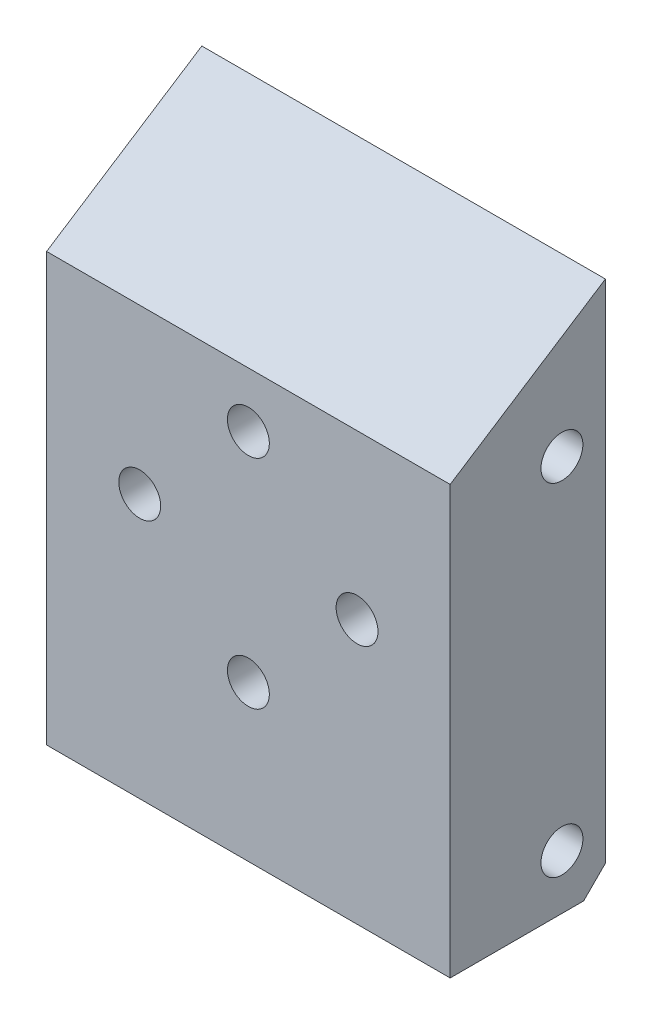
ISO-10303-21;
HEADER;
FILE_DESCRIPTION(('STEP AP214'),'2;1');
FILE_NAME('part.step','',(''),(''),'','','');
FILE_SCHEMA(('AUTOMOTIVE_DESIGN { 1 0 10303 214 1 1 1 1 }'));
ENDSEC;
DATA;
#1=APPLICATION_CONTEXT('core data for automotive mechanical design processes');
#2=APPLICATION_PROTOCOL_DEFINITION('international standard','automotive_design',2000,#1);
#3=PRODUCT_CONTEXT('',#1,'mechanical');
#4=PRODUCT('Part','Part','',(#3));
#5=PRODUCT_RELATED_PRODUCT_CATEGORY('part','',(#4));
#6=PRODUCT_DEFINITION_FORMATION('','',#4);
#7=PRODUCT_DEFINITION_CONTEXT('part definition',#1,'design');
#8=PRODUCT_DEFINITION('design','',#6,#7);
#9=PRODUCT_DEFINITION_SHAPE('','',#8);
#10=(LENGTH_UNIT() NAMED_UNIT(*) SI_UNIT(.MILLI.,.METRE.));
#11=(NAMED_UNIT(*) PLANE_ANGLE_UNIT() SI_UNIT($,.RADIAN.));
#12=(NAMED_UNIT(*) SI_UNIT($,.STERADIAN.) SOLID_ANGLE_UNIT());
#13=UNCERTAINTY_MEASURE_WITH_UNIT(LENGTH_MEASURE(1.E-05),#10,'distance_accuracy_value','');
#14=(GEOMETRIC_REPRESENTATION_CONTEXT(3) GLOBAL_UNCERTAINTY_ASSIGNED_CONTEXT((#13)) GLOBAL_UNIT_ASSIGNED_CONTEXT((#10,
#11,#12)) REPRESENTATION_CONTEXT('',''));
#15=CARTESIAN_POINT('',(0.,0.,0.));
#16=DIRECTION('',(0.,0.,1.));
#17=DIRECTION('',(1.,0.,0.));
#18=AXIS2_PLACEMENT_3D('',#15,#16,#17);
#19=CARTESIAN_POINT('',(13.,-17.,10.));
#20=DIRECTION('',(-1.,0.,0.));
#21=DIRECTION('',(0.,0.,1.));
#22=AXIS2_PLACEMENT_3D('',#19,#20,#21);
#23=PLANE('',#22);
#24=CARTESIAN_POINT('',(13.,8.50000000000001,2.8));
#25=DIRECTION('',(1.,0.,0.));
#26=DIRECTION('',(0.,0.,-1.));
#27=AXIS2_PLACEMENT_3D('',#24,#25,#26);
#28=CIRCLE('',#27,1.35);
#29=CARTESIAN_POINT('',(13.,8.50000000000001,1.45));
#30=VERTEX_POINT('',#29);
#31=EDGE_CURVE('E382',#30,#30,#28,.T.);
#32=ORIENTED_EDGE('',*,*,#31,.F.);
#33=EDGE_LOOP('',(#32));
#34=FACE_BOUND('',#33,.T.);
#35=CARTESIAN_POINT('',(13.,-13.5,2.8));
#36=DIRECTION('',(1.,0.,0.));
#37=DIRECTION('',(0.,0.,-1.));
#38=AXIS2_PLACEMENT_3D('',#35,#36,#37);
#39=CIRCLE('',#38,1.35);
#40=CARTESIAN_POINT('',(13.,-13.5,1.45));
#41=VERTEX_POINT('',#40);
#42=EDGE_CURVE('E376',#41,#41,#39,.T.);
#43=ORIENTED_EDGE('',*,*,#42,.F.);
#44=EDGE_LOOP('',(#43));
#45=FACE_BOUND('',#44,.T.);
#46=DIRECTION('',(0.,1.,0.));
#47=VECTOR('',#46,1.);
#48=CARTESIAN_POINT('',(13.,-17.,0.));
#49=LINE('',#48,#47);
#50=CARTESIAN_POINT('',(13.,-15.6,0.));
#51=VERTEX_POINT('',#50);
#52=CARTESIAN_POINT('',(13.,17.,0.));
#53=VERTEX_POINT('',#52);
#54=EDGE_CURVE('E99',#51,#53,#49,.T.);
#55=ORIENTED_EDGE('',*,*,#54,.T.);
#56=DIRECTION('',(0.,0.542738573048496,-0.839901685511633));
#57=VECTOR('',#56,1.);
#58=CARTESIAN_POINT('',(13.,10.5380702002297,10.));
#59=LINE('',#58,#57);
#60=CARTESIAN_POINT('',(13.,10.5380702002297,10.));
#61=VERTEX_POINT('',#60);
#62=EDGE_CURVE('E92',#61,#53,#59,.T.);
#63=ORIENTED_EDGE('',*,*,#62,.F.);
#64=DIRECTION('',(0.,1.,0.));
#65=VECTOR('',#64,1.);
#66=CARTESIAN_POINT('',(13.,-17.,10.));
#67=LINE('',#66,#65);
#68=CARTESIAN_POINT('',(13.,-17.,10.));
#69=VERTEX_POINT('',#68);
#70=EDGE_CURVE('E102',#69,#61,#67,.T.);
#71=ORIENTED_EDGE('',*,*,#70,.F.);
#72=DIRECTION('',(0.,0.,-1.));
#73=VECTOR('',#72,1.);
#74=CARTESIAN_POINT('',(13.,-17.,10.));
#75=LINE('',#74,#73);
#76=CARTESIAN_POINT('',(13.,-17.,1.4));
#77=VERTEX_POINT('',#76);
#78=EDGE_CURVE('E124',#69,#77,#75,.T.);
#79=ORIENTED_EDGE('',*,*,#78,.T.);
#80=DIRECTION('',(0.,0.707106781186549,-0.707106781186546));
#81=VECTOR('',#80,1.);
#82=CARTESIAN_POINT('',(13.,-17.,1.4));
#83=LINE('',#82,#81);
#84=EDGE_CURVE('E65',#77,#51,#83,.T.);
#85=ORIENTED_EDGE('',*,*,#84,.T.);
#86=EDGE_LOOP('',(#55,#63,#71,#79,#85));
#87=FACE_BOUND('',#86,.T.);
#88=ADVANCED_FACE('F41',(#34,#45,#87),#23,.F.);
#89=CARTESIAN_POINT('',(-13.,-17.,10.));
#90=DIRECTION('',(1.,0.,0.));
#91=DIRECTION('',(0.,0.,-1.));
#92=AXIS2_PLACEMENT_3D('',#89,#90,#91);
#93=PLANE('',#92);
#94=CARTESIAN_POINT('',(-13.,8.50000000000001,2.8));
#95=DIRECTION('',(-1.,0.,0.));
#96=DIRECTION('',(0.,0.,1.));
#97=AXIS2_PLACEMENT_3D('',#94,#95,#96);
#98=CIRCLE('',#97,1.025);
#99=CARTESIAN_POINT('',(-13.,8.50000000000001,3.825));
#100=VERTEX_POINT('',#99);
#101=EDGE_CURVE('E385',#100,#100,#98,.T.);
#102=ORIENTED_EDGE('',*,*,#101,.F.);
#103=EDGE_LOOP('',(#102));
#104=FACE_BOUND('',#103,.T.);
#105=CARTESIAN_POINT('',(-13.,-13.5,2.8));
#106=DIRECTION('',(-1.,0.,0.));
#107=DIRECTION('',(0.,0.,1.));
#108=AXIS2_PLACEMENT_3D('',#105,#106,#107);
#109=CIRCLE('',#108,1.025);
#110=CARTESIAN_POINT('',(-13.,-13.5,3.825));
#111=VERTEX_POINT('',#110);
#112=EDGE_CURVE('E396',#111,#111,#109,.T.);
#113=ORIENTED_EDGE('',*,*,#112,.F.);
#114=EDGE_LOOP('',(#113));
#115=FACE_BOUND('',#114,.T.);
#116=DIRECTION('',(0.,-1.,0.));
#117=VECTOR('',#116,1.);
#118=CARTESIAN_POINT('',(-13.,-17.,10.));
#119=LINE('',#118,#117);
#120=CARTESIAN_POINT('',(-13.,10.5380702002297,10.));
#121=VERTEX_POINT('',#120);
#122=CARTESIAN_POINT('',(-13.,-17.,10.));
#123=VERTEX_POINT('',#122);
#124=EDGE_CURVE('E112',#121,#123,#119,.T.);
#125=ORIENTED_EDGE('',*,*,#124,.F.);
#126=DIRECTION('',(0.,0.542738573048496,-0.839901685511633));
#127=VECTOR('',#126,1.);
#128=CARTESIAN_POINT('',(-13.,10.5380702002297,10.));
#129=LINE('',#128,#127);
#130=CARTESIAN_POINT('',(-13.,17.,0.));
#131=VERTEX_POINT('',#130);
#132=EDGE_CURVE('E94',#121,#131,#129,.T.);
#133=ORIENTED_EDGE('',*,*,#132,.T.);
#134=DIRECTION('',(0.,-1.,0.));
#135=VECTOR('',#134,1.);
#136=CARTESIAN_POINT('',(-13.,-17.,0.));
#137=LINE('',#136,#135);
#138=CARTESIAN_POINT('',(-13.,-15.6,0.));
#139=VERTEX_POINT('',#138);
#140=EDGE_CURVE('E113',#131,#139,#137,.T.);
#141=ORIENTED_EDGE('',*,*,#140,.T.);
#142=DIRECTION('',(0.,-0.707106781186549,0.707106781186546));
#143=VECTOR('',#142,1.);
#144=CARTESIAN_POINT('',(-13.,-17.,1.4));
#145=LINE('',#144,#143);
#146=CARTESIAN_POINT('',(-13.,-17.,1.4));
#147=VERTEX_POINT('',#146);
#148=EDGE_CURVE('E11',#139,#147,#145,.T.);
#149=ORIENTED_EDGE('',*,*,#148,.T.);
#150=DIRECTION('',(0.,0.,-1.));
#151=VECTOR('',#150,1.);
#152=CARTESIAN_POINT('',(-13.,-17.,10.));
#153=LINE('',#152,#151);
#154=EDGE_CURVE('E131',#123,#147,#153,.T.);
#155=ORIENTED_EDGE('',*,*,#154,.F.);
#156=EDGE_LOOP('',(#125,#133,#141,#149,#155));
#157=FACE_BOUND('',#156,.T.);
#158=ADVANCED_FACE('F148',(#104,#115,#157),#93,.F.);
#159=CARTESIAN_POINT('',(-13.,-17.,10.));
#160=DIRECTION('',(0.,1.,0.));
#161=DIRECTION('',(0.,0.,1.));
#162=AXIS2_PLACEMENT_3D('',#159,#160,#161);
#163=PLANE('',#162);
#164=ORIENTED_EDGE('',*,*,#154,.T.);
#165=DIRECTION('',(1.,0.,0.));
#166=VECTOR('',#165,1.);
#167=CARTESIAN_POINT('',(13.,-17.,1.4));
#168=LINE('',#167,#166);
#169=EDGE_CURVE('E135',#147,#77,#168,.T.);
#170=ORIENTED_EDGE('',*,*,#169,.T.);
#171=ORIENTED_EDGE('',*,*,#78,.F.);
#172=DIRECTION('',(1.,0.,0.));
#173=VECTOR('',#172,1.);
#174=CARTESIAN_POINT('',(-13.,-17.,10.));
#175=LINE('',#174,#173);
#176=EDGE_CURVE('E109',#123,#69,#175,.T.);
#177=ORIENTED_EDGE('',*,*,#176,.F.);
#178=EDGE_LOOP('',(#164,#170,#171,#177));
#179=FACE_BOUND('',#178,.T.);
#180=ADVANCED_FACE('F143',(#179),#163,.F.);
#181=CARTESIAN_POINT('',(0.,0.,10.));
#182=DIRECTION('',(0.,0.,-1.));
#183=DIRECTION('',(-1.,0.,0.));
#184=AXIS2_PLACEMENT_3D('',#181,#182,#183);
#185=PLANE('',#184);
#186=CARTESIAN_POINT('',(7.,0.,10.));
#187=DIRECTION('',(0.,0.,1.));
#188=DIRECTION('',(1.,0.,0.));
#189=AXIS2_PLACEMENT_3D('',#186,#187,#188);
#190=CIRCLE('',#189,1.35);
#191=CARTESIAN_POINT('',(8.35,0.,10.));
#192=VERTEX_POINT('',#191);
#193=EDGE_CURVE('E432',#192,#192,#190,.T.);
#194=ORIENTED_EDGE('',*,*,#193,.F.);
#195=EDGE_LOOP('',(#194));
#196=FACE_BOUND('',#195,.T.);
#197=CARTESIAN_POINT('',(0.,-7.,10.));
#198=DIRECTION('',(0.,0.,1.));
#199=DIRECTION('',(1.,0.,0.));
#200=AXIS2_PLACEMENT_3D('',#197,#198,#199);
#201=CIRCLE('',#200,1.35);
#202=CARTESIAN_POINT('',(1.34999999999999,-7.,10.));
#203=VERTEX_POINT('',#202);
#204=EDGE_CURVE('E424',#203,#203,#201,.T.);
#205=ORIENTED_EDGE('',*,*,#204,.F.);
#206=EDGE_LOOP('',(#205));
#207=FACE_BOUND('',#206,.T.);
#208=CARTESIAN_POINT('',(-7.,0.,10.));
#209=DIRECTION('',(0.,0.,1.));
#210=DIRECTION('',(1.,0.,0.));
#211=AXIS2_PLACEMENT_3D('',#208,#209,#210);
#212=CIRCLE('',#211,1.35);
#213=CARTESIAN_POINT('',(-5.65,0.,10.));
#214=VERTEX_POINT('',#213);
#215=EDGE_CURVE('E416',#214,#214,#212,.T.);
#216=ORIENTED_EDGE('',*,*,#215,.F.);
#217=EDGE_LOOP('',(#216));
#218=FACE_BOUND('',#217,.T.);
#219=CARTESIAN_POINT('',(0.,7.,10.));
#220=DIRECTION('',(0.,0.,1.));
#221=DIRECTION('',(1.,0.,0.));
#222=AXIS2_PLACEMENT_3D('',#219,#220,#221);
#223=CIRCLE('',#222,1.34999999999998);
#224=CARTESIAN_POINT('',(1.34999999999998,7.,10.));
#225=VERTEX_POINT('',#224);
#226=EDGE_CURVE('E408',#225,#225,#223,.T.);
#227=ORIENTED_EDGE('',*,*,#226,.F.);
#228=EDGE_LOOP('',(#227));
#229=FACE_BOUND('',#228,.T.);
#230=ORIENTED_EDGE('',*,*,#70,.T.);
#231=DIRECTION('',(1.,0.,0.));
#232=VECTOR('',#231,1.);
#233=CARTESIAN_POINT('',(-13.,10.5380702002297,10.));
#234=LINE('',#233,#232);
#235=EDGE_CURVE('E89',#121,#61,#234,.T.);
#236=ORIENTED_EDGE('',*,*,#235,.F.);
#237=ORIENTED_EDGE('',*,*,#124,.T.);
#238=ORIENTED_EDGE('',*,*,#176,.T.);
#239=EDGE_LOOP('',(#230,#236,#237,#238));
#240=FACE_BOUND('',#239,.T.);
#241=ADVANCED_FACE('F107',(#196,#207,#218,#229,#240),#185,.F.);
#242=CARTESIAN_POINT('',(0.,0.,0.));
#243=DIRECTION('',(0.,0.,-1.));
#244=DIRECTION('',(-1.,0.,0.));
#245=AXIS2_PLACEMENT_3D('',#242,#243,#244);
#246=PLANE('',#245);
#247=ORIENTED_EDGE('',*,*,#54,.F.);
#248=DIRECTION('',(-1.,0.,0.));
#249=VECTOR('',#248,1.);
#250=CARTESIAN_POINT('',(-13.,-15.6,0.));
#251=LINE('',#250,#249);
#252=EDGE_CURVE('E51',#51,#139,#251,.T.);
#253=ORIENTED_EDGE('',*,*,#252,.T.);
#254=ORIENTED_EDGE('',*,*,#140,.F.);
#255=DIRECTION('',(-1.,0.,0.));
#256=VECTOR('',#255,1.);
#257=CARTESIAN_POINT('',(-13.,17.,0.));
#258=LINE('',#257,#256);
#259=EDGE_CURVE('E118',#53,#131,#258,.T.);
#260=ORIENTED_EDGE('',*,*,#259,.F.);
#261=EDGE_LOOP('',(#247,#253,#254,#260));
#262=FACE_BOUND('',#261,.T.);
#263=ADVANCED_FACE('F149',(#262),#246,.T.);
#264=CARTESIAN_POINT('',(-13.,-17.,1.4));
#265=DIRECTION('',(0.,-0.707106781186546,-0.707106781186549));
#266=DIRECTION('',(-1.,0.,0.));
#267=AXIS2_PLACEMENT_3D('',#264,#265,#266);
#268=PLANE('',#267);
#269=ORIENTED_EDGE('',*,*,#148,.F.);
#270=ORIENTED_EDGE('',*,*,#252,.F.);
#271=ORIENTED_EDGE('',*,*,#84,.F.);
#272=ORIENTED_EDGE('',*,*,#169,.F.);
#273=EDGE_LOOP('',(#269,#270,#271,#272));
#274=FACE_BOUND('',#273,.T.);
#275=ADVANCED_FACE('F44',(#274),#268,.T.);
#276=CARTESIAN_POINT('',(-13.,10.5380702002297,10.));
#277=DIRECTION('',(0.,-0.839901685511633,-0.542738573048496));
#278=DIRECTION('',(0.,0.542738573048496,-0.839901685511633));
#279=AXIS2_PLACEMENT_3D('',#276,#277,#278);
#280=PLANE('',#279);
#281=ORIENTED_EDGE('',*,*,#259,.T.);
#282=ORIENTED_EDGE('',*,*,#132,.F.);
#283=ORIENTED_EDGE('',*,*,#235,.T.);
#284=ORIENTED_EDGE('',*,*,#62,.T.);
#285=EDGE_LOOP('',(#281,#282,#283,#284));
#286=FACE_BOUND('',#285,.T.);
#287=ADVANCED_FACE('F91',(#286),#280,.F.);
#288=CARTESIAN_POINT('',(3.,-13.5,2.8));
#289=DIRECTION('',(1.,0.,0.));
#290=DIRECTION('',(0.,0.,-1.));
#291=AXIS2_PLACEMENT_3D('',#288,#289,#290);
#292=CYLINDRICAL_SURFACE('',#291,1.35);
#293=CARTESIAN_POINT('',(3.,-13.5,2.8));
#294=DIRECTION('',(1.,0.,0.));
#295=DIRECTION('',(0.,0.,-1.));
#296=AXIS2_PLACEMENT_3D('',#293,#294,#295);
#297=CIRCLE('',#296,1.35);
#298=CARTESIAN_POINT('',(3.,-13.5,1.45));
#299=VERTEX_POINT('',#298);
#300=EDGE_CURVE('E373',#299,#299,#297,.T.);
#301=ORIENTED_EDGE('',*,*,#300,.F.);
#302=EDGE_LOOP('',(#301));
#303=FACE_BOUND('',#302,.T.);
#304=ORIENTED_EDGE('',*,*,#42,.T.);
#305=EDGE_LOOP('',(#304));
#306=FACE_BOUND('',#305,.T.);
#307=ADVANCED_FACE('F296',(#303,#306),#292,.F.);
#308=CARTESIAN_POINT('',(3.,-13.5,2.8));
#309=DIRECTION('',(1.,0.,0.));
#310=DIRECTION('',(0.,0.,-1.));
#311=AXIS2_PLACEMENT_3D('',#308,#309,#310);
#312=PLANE('',#311);
#313=ORIENTED_EDGE('',*,*,#300,.T.);
#314=EDGE_LOOP('',(#313));
#315=FACE_BOUND('',#314,.T.);
#316=ADVANCED_FACE('F292',(#315),#312,.T.);
#317=CARTESIAN_POINT('',(3.,8.50000000000001,2.8));
#318=DIRECTION('',(1.,0.,0.));
#319=DIRECTION('',(0.,0.,-1.));
#320=AXIS2_PLACEMENT_3D('',#317,#318,#319);
#321=CYLINDRICAL_SURFACE('',#320,1.35);
#322=CARTESIAN_POINT('',(3.,8.50000000000001,2.8));
#323=DIRECTION('',(1.,0.,0.));
#324=DIRECTION('',(0.,0.,-1.));
#325=AXIS2_PLACEMENT_3D('',#322,#323,#324);
#326=CIRCLE('',#325,1.35);
#327=CARTESIAN_POINT('',(3.,8.50000000000001,1.45));
#328=VERTEX_POINT('',#327);
#329=EDGE_CURVE('E105',#328,#328,#326,.T.);
#330=ORIENTED_EDGE('',*,*,#329,.F.);
#331=EDGE_LOOP('',(#330));
#332=FACE_BOUND('',#331,.T.);
#333=ORIENTED_EDGE('',*,*,#31,.T.);
#334=EDGE_LOOP('',(#333));
#335=FACE_BOUND('',#334,.T.);
#336=ADVANCED_FACE('F288',(#332,#335),#321,.F.);
#337=CARTESIAN_POINT('',(3.,8.50000000000001,2.8));
#338=DIRECTION('',(1.,0.,0.));
#339=DIRECTION('',(0.,0.,-1.));
#340=AXIS2_PLACEMENT_3D('',#337,#338,#339);
#341=PLANE('',#340);
#342=ORIENTED_EDGE('',*,*,#329,.T.);
#343=EDGE_LOOP('',(#342));
#344=FACE_BOUND('',#343,.T.);
#345=ADVANCED_FACE('F284',(#344),#341,.T.);
#346=CARTESIAN_POINT('',(-3.,-13.5,2.8));
#347=DIRECTION('',(-1.,0.,0.));
#348=DIRECTION('',(0.,0.,1.));
#349=AXIS2_PLACEMENT_3D('',#346,#347,#348);
#350=CYLINDRICAL_SURFACE('',#349,1.025);
#351=CARTESIAN_POINT('',(-3.,-13.5,2.8));
#352=DIRECTION('',(-1.,0.,0.));
#353=DIRECTION('',(0.,0.,1.));
#354=AXIS2_PLACEMENT_3D('',#351,#352,#353);
#355=CIRCLE('',#354,1.025);
#356=CARTESIAN_POINT('',(-3.,-13.5,3.825));
#357=VERTEX_POINT('',#356);
#358=EDGE_CURVE('E400',#357,#357,#355,.T.);
#359=ORIENTED_EDGE('',*,*,#358,.F.);
#360=EDGE_LOOP('',(#359));
#361=FACE_BOUND('',#360,.T.);
#362=ORIENTED_EDGE('',*,*,#112,.T.);
#363=EDGE_LOOP('',(#362));
#364=FACE_BOUND('',#363,.T.);
#365=ADVANCED_FACE('F280',(#361,#364),#350,.F.);
#366=CARTESIAN_POINT('',(-3.,-13.5,2.8));
#367=DIRECTION('',(-1.,0.,0.));
#368=DIRECTION('',(0.,0.,1.));
#369=AXIS2_PLACEMENT_3D('',#366,#367,#368);
#370=PLANE('',#369);
#371=ORIENTED_EDGE('',*,*,#358,.T.);
#372=EDGE_LOOP('',(#371));
#373=FACE_BOUND('',#372,.T.);
#374=ADVANCED_FACE('F276',(#373),#370,.T.);
#375=CARTESIAN_POINT('',(-3.,8.50000000000001,2.8));
#376=DIRECTION('',(-1.,0.,0.));
#377=DIRECTION('',(0.,0.,1.));
#378=AXIS2_PLACEMENT_3D('',#375,#376,#377);
#379=CYLINDRICAL_SURFACE('',#378,1.025);
#380=CARTESIAN_POINT('',(-3.,8.50000000000001,2.8));
#381=DIRECTION('',(-1.,0.,0.));
#382=DIRECTION('',(0.,0.,1.));
#383=AXIS2_PLACEMENT_3D('',#380,#381,#382);
#384=CIRCLE('',#383,1.025);
#385=CARTESIAN_POINT('',(-3.,8.50000000000001,3.825));
#386=VERTEX_POINT('',#385);
#387=EDGE_CURVE('E378',#386,#386,#384,.T.);
#388=ORIENTED_EDGE('',*,*,#387,.F.);
#389=EDGE_LOOP('',(#388));
#390=FACE_BOUND('',#389,.T.);
#391=ORIENTED_EDGE('',*,*,#101,.T.);
#392=EDGE_LOOP('',(#391));
#393=FACE_BOUND('',#392,.T.);
#394=ADVANCED_FACE('F272',(#390,#393),#379,.F.);
#395=CARTESIAN_POINT('',(-3.,8.50000000000001,2.8));
#396=DIRECTION('',(-1.,0.,0.));
#397=DIRECTION('',(0.,0.,1.));
#398=AXIS2_PLACEMENT_3D('',#395,#396,#397);
#399=PLANE('',#398);
#400=ORIENTED_EDGE('',*,*,#387,.T.);
#401=EDGE_LOOP('',(#400));
#402=FACE_BOUND('',#401,.T.);
#403=ADVANCED_FACE('F185',(#402),#399,.T.);
#404=CARTESIAN_POINT('',(0.,7.,6.));
#405=DIRECTION('',(0.,0.,1.));
#406=DIRECTION('',(1.,0.,0.));
#407=AXIS2_PLACEMENT_3D('',#404,#405,#406);
#408=CYLINDRICAL_SURFACE('',#407,1.34999999999998);
#409=CARTESIAN_POINT('',(0.,7.,6.));
#410=DIRECTION('',(0.,0.,1.));
#411=DIRECTION('',(1.,0.,0.));
#412=AXIS2_PLACEMENT_3D('',#409,#410,#411);
#413=CIRCLE('',#412,1.34999999999998);
#414=CARTESIAN_POINT('',(1.34999999999998,7.,6.));
#415=VERTEX_POINT('',#414);
#416=EDGE_CURVE('E412',#415,#415,#413,.T.);
#417=ORIENTED_EDGE('',*,*,#416,.F.);
#418=EDGE_LOOP('',(#417));
#419=FACE_BOUND('',#418,.T.);
#420=ORIENTED_EDGE('',*,*,#226,.T.);
#421=EDGE_LOOP('',(#420));
#422=FACE_BOUND('',#421,.T.);
#423=ADVANCED_FACE('F190',(#419,#422),#408,.F.);
#424=CARTESIAN_POINT('',(0.,7.,6.));
#425=DIRECTION('',(0.,0.,1.));
#426=DIRECTION('',(1.,0.,0.));
#427=AXIS2_PLACEMENT_3D('',#424,#425,#426);
#428=PLANE('',#427);
#429=ORIENTED_EDGE('',*,*,#416,.T.);
#430=EDGE_LOOP('',(#429));
#431=FACE_BOUND('',#430,.T.);
#432=ADVANCED_FACE('F195',(#431),#428,.T.);
#433=CARTESIAN_POINT('',(-7.,0.,6.));
#434=DIRECTION('',(0.,0.,1.));
#435=DIRECTION('',(1.,0.,0.));
#436=AXIS2_PLACEMENT_3D('',#433,#434,#435);
#437=CYLINDRICAL_SURFACE('',#436,1.35);
#438=CARTESIAN_POINT('',(-7.,0.,6.));
#439=DIRECTION('',(0.,0.,1.));
#440=DIRECTION('',(1.,0.,0.));
#441=AXIS2_PLACEMENT_3D('',#438,#439,#440);
#442=CIRCLE('',#441,1.35);
#443=CARTESIAN_POINT('',(-5.65,0.,6.));
#444=VERTEX_POINT('',#443);
#445=EDGE_CURVE('E420',#444,#444,#442,.T.);
#446=ORIENTED_EDGE('',*,*,#445,.F.);
#447=EDGE_LOOP('',(#446));
#448=FACE_BOUND('',#447,.T.);
#449=ORIENTED_EDGE('',*,*,#215,.T.);
#450=EDGE_LOOP('',(#449));
#451=FACE_BOUND('',#450,.T.);
#452=ADVANCED_FACE('F205',(#448,#451),#437,.F.);
#453=CARTESIAN_POINT('',(-7.,0.,6.));
#454=DIRECTION('',(0.,0.,1.));
#455=DIRECTION('',(1.,0.,0.));
#456=AXIS2_PLACEMENT_3D('',#453,#454,#455);
#457=PLANE('',#456);
#458=ORIENTED_EDGE('',*,*,#445,.T.);
#459=EDGE_LOOP('',(#458));
#460=FACE_BOUND('',#459,.T.);
#461=ADVANCED_FACE('F215',(#460),#457,.T.);
#462=CARTESIAN_POINT('',(0.,-7.,6.));
#463=DIRECTION('',(0.,0.,1.));
#464=DIRECTION('',(1.,0.,0.));
#465=AXIS2_PLACEMENT_3D('',#462,#463,#464);
#466=CYLINDRICAL_SURFACE('',#465,1.35);
#467=CARTESIAN_POINT('',(0.,-7.,6.));
#468=DIRECTION('',(0.,0.,1.));
#469=DIRECTION('',(1.,0.,0.));
#470=AXIS2_PLACEMENT_3D('',#467,#468,#469);
#471=CIRCLE('',#470,1.35);
#472=CARTESIAN_POINT('',(1.34999999999999,-7.,6.));
#473=VERTEX_POINT('',#472);
#474=EDGE_CURVE('E428',#473,#473,#471,.T.);
#475=ORIENTED_EDGE('',*,*,#474,.F.);
#476=EDGE_LOOP('',(#475));
#477=FACE_BOUND('',#476,.T.);
#478=ORIENTED_EDGE('',*,*,#204,.T.);
#479=EDGE_LOOP('',(#478));
#480=FACE_BOUND('',#479,.T.);
#481=ADVANCED_FACE('F225',(#477,#480),#466,.F.);
#482=CARTESIAN_POINT('',(0.,-7.,6.));
#483=DIRECTION('',(0.,0.,1.));
#484=DIRECTION('',(1.,0.,0.));
#485=AXIS2_PLACEMENT_3D('',#482,#483,#484);
#486=PLANE('',#485);
#487=ORIENTED_EDGE('',*,*,#474,.T.);
#488=EDGE_LOOP('',(#487));
#489=FACE_BOUND('',#488,.T.);
#490=ADVANCED_FACE('F235',(#489),#486,.T.);
#491=CARTESIAN_POINT('',(7.,0.,6.));
#492=DIRECTION('',(0.,0.,1.));
#493=DIRECTION('',(1.,0.,0.));
#494=AXIS2_PLACEMENT_3D('',#491,#492,#493);
#495=CYLINDRICAL_SURFACE('',#494,1.35);
#496=CARTESIAN_POINT('',(7.,0.,6.));
#497=DIRECTION('',(0.,0.,1.));
#498=DIRECTION('',(1.,0.,0.));
#499=AXIS2_PLACEMENT_3D('',#496,#497,#498);
#500=CIRCLE('',#499,1.35);
#501=CARTESIAN_POINT('',(8.35,0.,6.));
#502=VERTEX_POINT('',#501);
#503=EDGE_CURVE('E401',#502,#502,#500,.T.);
#504=ORIENTED_EDGE('',*,*,#503,.F.);
#505=EDGE_LOOP('',(#504));
#506=FACE_BOUND('',#505,.T.);
#507=ORIENTED_EDGE('',*,*,#193,.T.);
#508=EDGE_LOOP('',(#507));
#509=FACE_BOUND('',#508,.T.);
#510=ADVANCED_FACE('F245',(#506,#509),#495,.F.);
#511=CARTESIAN_POINT('',(7.,0.,6.));
#512=DIRECTION('',(0.,0.,1.));
#513=DIRECTION('',(1.,0.,0.));
#514=AXIS2_PLACEMENT_3D('',#511,#512,#513);
#515=PLANE('',#514);
#516=ORIENTED_EDGE('',*,*,#503,.T.);
#517=EDGE_LOOP('',(#516));
#518=FACE_BOUND('',#517,.T.);
#519=ADVANCED_FACE('F255',(#518),#515,.T.);
#520=CLOSED_SHELL('',(#88,#158,#180,#241,#263,#275,#287,#307,#316,#336,#345,#365,#374,#394,#403,
#423,#432,#452,#461,#481,#490,#510,#519));
#521=MANIFOLD_SOLID_BREP('B2',#520);
#522=ADVANCED_BREP_SHAPE_REPRESENTATION('',(#18,#521),#14);
#523=SHAPE_DEFINITION_REPRESENTATION(#9,#522);
ENDSEC;
END-ISO-10303-21;
